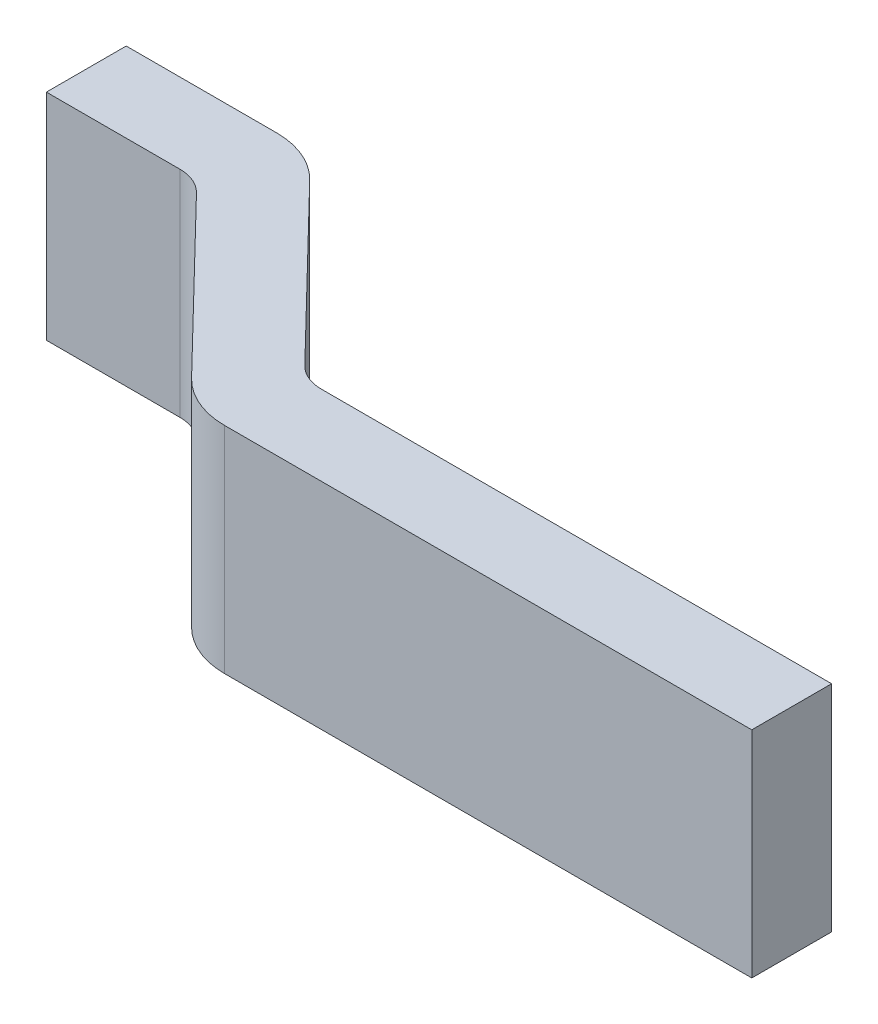
ISO-10303-21;
HEADER;
FILE_DESCRIPTION(('STEP AP214'),'2;1');
FILE_NAME('part.step','',(''),(''),'','','');
FILE_SCHEMA(('AUTOMOTIVE_DESIGN { 1 0 10303 214 1 1 1 1 }'));
ENDSEC;
DATA;
#1=APPLICATION_CONTEXT('core data for automotive mechanical design processes');
#2=APPLICATION_PROTOCOL_DEFINITION('international standard','automotive_design',2000,#1);
#3=PRODUCT_CONTEXT('',#1,'mechanical');
#4=PRODUCT('Part','Part','',(#3));
#5=PRODUCT_RELATED_PRODUCT_CATEGORY('part','',(#4));
#6=PRODUCT_DEFINITION_FORMATION('','',#4);
#7=PRODUCT_DEFINITION_CONTEXT('part definition',#1,'design');
#8=PRODUCT_DEFINITION('design','',#6,#7);
#9=PRODUCT_DEFINITION_SHAPE('','',#8);
#10=(LENGTH_UNIT() NAMED_UNIT(*) SI_UNIT(.MILLI.,.METRE.));
#11=(NAMED_UNIT(*) PLANE_ANGLE_UNIT() SI_UNIT($,.RADIAN.));
#12=(NAMED_UNIT(*) SI_UNIT($,.STERADIAN.) SOLID_ANGLE_UNIT());
#13=UNCERTAINTY_MEASURE_WITH_UNIT(LENGTH_MEASURE(1.E-05),#10,'distance_accuracy_value','');
#14=(GEOMETRIC_REPRESENTATION_CONTEXT(3) GLOBAL_UNCERTAINTY_ASSIGNED_CONTEXT((#13)) GLOBAL_UNIT_ASSIGNED_CONTEXT((#10,
#11,#12)) REPRESENTATION_CONTEXT('',''));
#15=CARTESIAN_POINT('',(0.,0.,0.));
#16=DIRECTION('',(0.,0.,1.));
#17=DIRECTION('',(1.,0.,0.));
#18=AXIS2_PLACEMENT_3D('',#15,#16,#17);
#19=CARTESIAN_POINT('',(-3.065047127576,-2.3,0.39));
#20=DIRECTION('',(0.,-1.,0.));
#21=DIRECTION('',(0.389734378406383,0.,-0.92092731216323));
#22=AXIS2_PLACEMENT_3D('',#19,#20,#21);
#23=CYLINDRICAL_SURFACE('',#22,0.13);
#24=CARTESIAN_POINT('',(-3.065047127576,-2.65,0.39));
#25=DIRECTION('',(0.,1.,0.));
#26=DIRECTION('',(0.389734378406383,0.,-0.92092731216323));
#27=AXIS2_PLACEMENT_3D('',#24,#25,#26);
#28=CIRCLE('',#27,0.13);
#29=CARTESIAN_POINT('',(-2.971728698849,-2.65,0.299492150285071));
#30=VERTEX_POINT('',#29);
#31=CARTESIAN_POINT('',(-3.065047127576,-2.65,0.26));
#32=VERTEX_POINT('',#31);
#33=EDGE_CURVE('E11',#30,#32,#28,.T.);
#34=ORIENTED_EDGE('',*,*,#33,.F.);
#35=DIRECTION('',(0.,-1.,0.));
#36=VECTOR('',#35,1.);
#37=CARTESIAN_POINT('',(-2.971728698849,-2.3,0.299492150285071));
#38=LINE('',#37,#36);
#39=CARTESIAN_POINT('',(-2.971728698849,-1.95,0.299492150285071));
#40=VERTEX_POINT('',#39);
#41=EDGE_CURVE('E24',#40,#30,#38,.T.);
#42=ORIENTED_EDGE('',*,*,#41,.F.);
#43=CARTESIAN_POINT('',(-3.065047127576,-1.95,0.39));
#44=DIRECTION('',(0.,-1.,0.));
#45=DIRECTION('',(0.389734378406383,0.,-0.92092731216323));
#46=AXIS2_PLACEMENT_3D('',#43,#44,#45);
#47=CIRCLE('',#46,0.13);
#48=CARTESIAN_POINT('',(-3.065047127576,-1.95,0.26));
#49=VERTEX_POINT('',#48);
#50=EDGE_CURVE('E201',#49,#40,#47,.T.);
#51=ORIENTED_EDGE('',*,*,#50,.F.);
#52=DIRECTION('',(0.,1.,0.));
#53=VECTOR('',#52,1.);
#54=CARTESIAN_POINT('',(-3.065047127576,-2.3,0.26));
#55=LINE('',#54,#53);
#56=EDGE_CURVE('E37',#32,#49,#55,.T.);
#57=ORIENTED_EDGE('',*,*,#56,.F.);
#58=EDGE_LOOP('',(#34,#42,#51,#57));
#59=FACE_BOUND('',#58,.T.);
#60=ADVANCED_FACE('F17',(#59),#23,.F.);
#61=CARTESIAN_POINT('',(-3.010031418384,-2.3,0.26));
#62=DIRECTION('',(0.,0.,-1.));
#63=DIRECTION('',(-1.,0.,0.));
#64=AXIS2_PLACEMENT_3D('',#61,#62,#63);
#65=PLANE('',#64);
#66=ORIENTED_EDGE('',*,*,#56,.T.);
#67=DIRECTION('',(-1.,0.,0.));
#68=VECTOR('',#67,1.);
#69=CARTESIAN_POINT('',(-2.9,-1.95,0.26));
#70=LINE('',#69,#68);
#71=CARTESIAN_POINT('',(-3.5,-1.95,0.26));
#72=VERTEX_POINT('',#71);
#73=EDGE_CURVE('E198',#49,#72,#70,.T.);
#74=ORIENTED_EDGE('',*,*,#73,.T.);
#75=DIRECTION('',(0.,1.,0.));
#76=VECTOR('',#75,1.);
#77=CARTESIAN_POINT('',(-3.5,-2.3,0.26));
#78=LINE('',#77,#76);
#79=CARTESIAN_POINT('',(-3.5,-2.65,0.26));
#80=VERTEX_POINT('',#79);
#81=EDGE_CURVE('E195',#80,#72,#78,.T.);
#82=ORIENTED_EDGE('',*,*,#81,.F.);
#83=DIRECTION('',(1.,0.,0.));
#84=VECTOR('',#83,1.);
#85=CARTESIAN_POINT('',(-2.9,-2.65,0.26));
#86=LINE('',#85,#84);
#87=EDGE_CURVE('E192',#80,#32,#86,.T.);
#88=ORIENTED_EDGE('',*,*,#87,.T.);
#89=EDGE_LOOP('',(#66,#74,#82,#88));
#90=FACE_BOUND('',#89,.T.);
#91=ADVANCED_FACE('F234',(#90),#65,.F.);
#92=CARTESIAN_POINT('',(-2.21456109233,-2.3,0.52));
#93=DIRECTION('',(0.,-1.,0.));
#94=DIRECTION('',(-0.389734378406383,0.,0.920927312163229));
#95=AXIS2_PLACEMENT_3D('',#92,#93,#94);
#96=CYLINDRICAL_SURFACE('',#95,0.13);
#97=CARTESIAN_POINT('',(-2.21456109233,-2.65,0.52));
#98=DIRECTION('',(0.,1.,0.));
#99=DIRECTION('',(-0.389734378406383,0.,0.920927312163229));
#100=AXIS2_PLACEMENT_3D('',#97,#98,#99);
#101=CIRCLE('',#100,0.13);
#102=CARTESIAN_POINT('',(-2.307879521056,-2.65,0.610507849714929));
#103=VERTEX_POINT('',#102);
#104=CARTESIAN_POINT('',(-2.21456109233,-2.65,0.65));
#105=VERTEX_POINT('',#104);
#106=EDGE_CURVE('E189',#103,#105,#101,.T.);
#107=ORIENTED_EDGE('',*,*,#106,.F.);
#108=DIRECTION('',(0.,-1.,0.));
#109=VECTOR('',#108,1.);
#110=CARTESIAN_POINT('',(-2.307879521056,-2.3,0.610507849714929));
#111=LINE('',#110,#109);
#112=CARTESIAN_POINT('',(-2.307879521056,-1.95,0.610507849714929));
#113=VERTEX_POINT('',#112);
#114=EDGE_CURVE('E187',#113,#103,#111,.T.);
#115=ORIENTED_EDGE('',*,*,#114,.F.);
#116=CARTESIAN_POINT('',(-2.21456109233,-1.95,0.52));
#117=DIRECTION('',(0.,-1.,0.));
#118=DIRECTION('',(-0.389734378406383,0.,0.920927312163229));
#119=AXIS2_PLACEMENT_3D('',#116,#117,#118);
#120=CIRCLE('',#119,0.13);
#121=CARTESIAN_POINT('',(-2.21456109233,-1.95,0.65));
#122=VERTEX_POINT('',#121);
#123=EDGE_CURVE('E185',#122,#113,#120,.T.);
#124=ORIENTED_EDGE('',*,*,#123,.F.);
#125=DIRECTION('',(0.,1.,0.));
#126=VECTOR('',#125,1.);
#127=CARTESIAN_POINT('',(-2.21456109233,-2.3,0.65));
#128=LINE('',#127,#126);
#129=EDGE_CURVE('E183',#105,#122,#128,.T.);
#130=ORIENTED_EDGE('',*,*,#129,.F.);
#131=EDGE_LOOP('',(#107,#115,#124,#130));
#132=FACE_BOUND('',#131,.T.);
#133=ADVANCED_FACE('F219',(#132),#96,.F.);
#134=CARTESIAN_POINT('',(-2.269576801522,-2.3,0.65));
#135=DIRECTION('',(0.,0.,1.));
#136=DIRECTION('',(1.,0.,0.));
#137=AXIS2_PLACEMENT_3D('',#134,#135,#136);
#138=PLANE('',#137);
#139=ORIENTED_EDGE('',*,*,#129,.T.);
#140=DIRECTION('',(1.,0.,0.));
#141=VECTOR('',#140,1.);
#142=CARTESIAN_POINT('',(-2.631777499297,-1.95,0.65));
#143=LINE('',#142,#141);
#144=CARTESIAN_POINT('',(-0.552686390507766,-1.95,0.65));
#145=VERTEX_POINT('',#144);
#146=EDGE_CURVE('E181',#122,#145,#143,.T.);
#147=ORIENTED_EDGE('',*,*,#146,.T.);
#148=DIRECTION('',(0.,-1.,0.));
#149=VECTOR('',#148,1.);
#150=CARTESIAN_POINT('',(-0.552686390507766,-2.3,0.65));
#151=LINE('',#150,#149);
#152=CARTESIAN_POINT('',(-0.552686390507766,-2.65,0.65));
#153=VERTEX_POINT('',#152);
#154=EDGE_CURVE('E129',#145,#153,#151,.T.);
#155=ORIENTED_EDGE('',*,*,#154,.T.);
#156=DIRECTION('',(-1.,0.,0.));
#157=VECTOR('',#156,1.);
#158=CARTESIAN_POINT('',(-2.631777499297,-2.65,0.65));
#159=LINE('',#158,#157);
#160=EDGE_CURVE('E177',#153,#105,#159,.T.);
#161=ORIENTED_EDGE('',*,*,#160,.T.);
#162=EDGE_LOOP('',(#139,#147,#155,#161));
#163=FACE_BOUND('',#162,.T.);
#164=ADVANCED_FACE('F214',(#163),#138,.F.);
#165=CARTESIAN_POINT('',(-2.269576801522,-2.3,0.65));
#166=DIRECTION('',(0.,-1.,0.));
#167=DIRECTION('',(-0.389734378406384,0.,0.920927312163229));
#168=AXIS2_PLACEMENT_3D('',#165,#166,#167);
#169=CYLINDRICAL_SURFACE('',#168,0.26);
#170=CARTESIAN_POINT('',(-2.269576801522,-1.95,0.65));
#171=DIRECTION('',(0.,1.,0.));
#172=DIRECTION('',(-0.389734378406384,0.,0.920927312163229));
#173=AXIS2_PLACEMENT_3D('',#170,#171,#172);
#174=CIRCLE('',#173,0.26);
#175=CARTESIAN_POINT('',(-2.456213658975,-1.95,0.831015699429859));
#176=VERTEX_POINT('',#175);
#177=CARTESIAN_POINT('',(-2.269576801522,-1.95,0.91));
#178=VERTEX_POINT('',#177);
#179=EDGE_CURVE('E124',#176,#178,#174,.T.);
#180=ORIENTED_EDGE('',*,*,#179,.F.);
#181=DIRECTION('',(0.,1.,0.));
#182=VECTOR('',#181,1.);
#183=CARTESIAN_POINT('',(-2.456213658975,-2.3,0.831015699429859));
#184=LINE('',#183,#182);
#185=CARTESIAN_POINT('',(-2.456213658975,-2.65,0.831015699429859));
#186=VERTEX_POINT('',#185);
#187=EDGE_CURVE('E173',#186,#176,#184,.T.);
#188=ORIENTED_EDGE('',*,*,#187,.F.);
#189=CARTESIAN_POINT('',(-2.269576801522,-2.65,0.65));
#190=DIRECTION('',(0.,-1.,0.));
#191=DIRECTION('',(-0.389734378406384,0.,0.920927312163229));
#192=AXIS2_PLACEMENT_3D('',#189,#190,#191);
#193=CIRCLE('',#192,0.26);
#194=CARTESIAN_POINT('',(-2.269576801522,-2.65,0.91));
#195=VERTEX_POINT('',#194);
#196=EDGE_CURVE('E170',#195,#186,#193,.T.);
#197=ORIENTED_EDGE('',*,*,#196,.F.);
#198=DIRECTION('',(0.,-1.,0.));
#199=VECTOR('',#198,1.);
#200=CARTESIAN_POINT('',(-2.269576801522,-2.3,0.91));
#201=LINE('',#200,#199);
#202=EDGE_CURVE('E168',#178,#195,#201,.T.);
#203=ORIENTED_EDGE('',*,*,#202,.F.);
#204=EDGE_LOOP('',(#180,#188,#197,#203));
#205=FACE_BOUND('',#204,.T.);
#206=ADVANCED_FACE('F207',(#205),#169,.T.);
#207=CARTESIAN_POINT('',(-2.379608219906,-2.3,0.91));
#208=DIRECTION('',(0.717834067126796,0.,-0.696214228576379));
#209=DIRECTION('',(-0.696214228576379,0.,-0.717834067126796));
#210=AXIS2_PLACEMENT_3D('',#207,#208,#209);
#211=PLANE('',#210);
#212=ORIENTED_EDGE('',*,*,#41,.T.);
#213=DIRECTION('',(0.696214228576379,0.,0.717834067126796));
#214=VECTOR('',#213,1.);
#215=CARTESIAN_POINT('',(-2.379608219906,-2.65,0.91));
#216=LINE('',#215,#214);
#217=EDGE_CURVE('E166',#30,#186,#216,.T.);
#218=ORIENTED_EDGE('',*,*,#217,.T.);
#219=ORIENTED_EDGE('',*,*,#187,.T.);
#220=DIRECTION('',(-0.696214228576379,0.,-0.717834067126796));
#221=VECTOR('',#220,1.);
#222=CARTESIAN_POINT('',(-2.379608219906,-1.95,0.91));
#223=LINE('',#222,#221);
#224=EDGE_CURVE('E164',#176,#40,#223,.T.);
#225=ORIENTED_EDGE('',*,*,#224,.T.);
#226=EDGE_LOOP('',(#212,#218,#219,#225));
#227=FACE_BOUND('',#226,.T.);
#228=ADVANCED_FACE('F205',(#227),#211,.F.);
#229=CARTESIAN_POINT('',(-2.026343195254,-2.65,0.455));
#230=DIRECTION('',(0.,1.,0.));
#231=DIRECTION('',(0.,0.,-1.));
#232=AXIS2_PLACEMENT_3D('',#229,#230,#231);
#233=PLANE('',#232);
#234=ORIENTED_EDGE('',*,*,#196,.T.);
#235=ORIENTED_EDGE('',*,*,#217,.F.);
#236=ORIENTED_EDGE('',*,*,#33,.T.);
#237=ORIENTED_EDGE('',*,*,#87,.F.);
#238=DIRECTION('',(0.,0.,1.));
#239=VECTOR('',#238,1.);
#240=CARTESIAN_POINT('',(-3.5,-2.65,0.26));
#241=LINE('',#240,#239);
#242=CARTESIAN_POINT('',(-3.5,-2.65,0.));
#243=VERTEX_POINT('',#242);
#244=EDGE_CURVE('E161',#243,#80,#241,.T.);
#245=ORIENTED_EDGE('',*,*,#244,.F.);
#246=DIRECTION('',(-1.,0.,0.));
#247=VECTOR('',#246,1.);
#248=CARTESIAN_POINT('',(-3.5,-2.65,0.));
#249=LINE('',#248,#247);
#250=CARTESIAN_POINT('',(-3.010031418384,-2.65,0.));
#251=VERTEX_POINT('',#250);
#252=EDGE_CURVE('E158',#251,#243,#249,.T.);
#253=ORIENTED_EDGE('',*,*,#252,.F.);
#254=CARTESIAN_POINT('',(-3.010031418384,-2.65,0.26));
#255=DIRECTION('',(0.,-1.,0.));
#256=DIRECTION('',(0.389734378406383,0.,-0.920927312163229));
#257=AXIS2_PLACEMENT_3D('',#254,#255,#256);
#258=CIRCLE('',#257,0.26);
#259=CARTESIAN_POINT('',(-2.823394560931,-2.65,0.0789843005701413));
#260=VERTEX_POINT('',#259);
#261=EDGE_CURVE('E156',#251,#260,#258,.T.);
#262=ORIENTED_EDGE('',*,*,#261,.T.);
#263=DIRECTION('',(-0.696214228576379,0.,-0.717834067126796));
#264=VECTOR('',#263,1.);
#265=CARTESIAN_POINT('',(-2.9,-2.65,0.));
#266=LINE('',#265,#264);
#267=EDGE_CURVE('E153',#103,#260,#266,.T.);
#268=ORIENTED_EDGE('',*,*,#267,.F.);
#269=ORIENTED_EDGE('',*,*,#106,.T.);
#270=ORIENTED_EDGE('',*,*,#160,.F.);
#271=DIRECTION('',(0.,0.,-1.));
#272=VECTOR('',#271,1.);
#273=CARTESIAN_POINT('',(-0.552686390507766,-2.65,0.65));
#274=LINE('',#273,#272);
#275=CARTESIAN_POINT('',(-0.552686390507766,-2.65,0.91));
#276=VERTEX_POINT('',#275);
#277=EDGE_CURVE('E151',#276,#153,#274,.T.);
#278=ORIENTED_EDGE('',*,*,#277,.F.);
#279=DIRECTION('',(1.,0.,0.));
#280=VECTOR('',#279,1.);
#281=CARTESIAN_POINT('',(-0.552686390507766,-2.65,0.91));
#282=LINE('',#281,#280);
#283=EDGE_CURVE('E112',#195,#276,#282,.T.);
#284=ORIENTED_EDGE('',*,*,#283,.F.);
#285=EDGE_LOOP('',(#234,#235,#236,#237,#245,#253,#262,#268,#269,#270,#278,#284));
#286=FACE_BOUND('',#285,.T.);
#287=ADVANCED_FACE('F209',(#286),#233,.F.);
#288=CARTESIAN_POINT('',(-3.010031418384,-2.3,0.26));
#289=DIRECTION('',(0.,-1.,0.));
#290=DIRECTION('',(0.389734378406383,0.,-0.920927312163229));
#291=AXIS2_PLACEMENT_3D('',#288,#289,#290);
#292=CYLINDRICAL_SURFACE('',#291,0.26);
#293=CARTESIAN_POINT('',(-3.010031418384,-1.95,0.26));
#294=DIRECTION('',(0.,1.,0.));
#295=DIRECTION('',(0.389734378406383,0.,-0.920927312163229));
#296=AXIS2_PLACEMENT_3D('',#293,#294,#295);
#297=CIRCLE('',#296,0.26);
#298=CARTESIAN_POINT('',(-2.823394560931,-1.95,0.0789843005701413));
#299=VERTEX_POINT('',#298);
#300=CARTESIAN_POINT('',(-3.010031418384,-1.95,0.));
#301=VERTEX_POINT('',#300);
#302=EDGE_CURVE('E148',#299,#301,#297,.T.);
#303=ORIENTED_EDGE('',*,*,#302,.F.);
#304=DIRECTION('',(0.,1.,0.));
#305=VECTOR('',#304,1.);
#306=CARTESIAN_POINT('',(-2.823394560931,-2.3,0.0789843005701413));
#307=LINE('',#306,#305);
#308=EDGE_CURVE('E145',#260,#299,#307,.T.);
#309=ORIENTED_EDGE('',*,*,#308,.F.);
#310=ORIENTED_EDGE('',*,*,#261,.F.);
#311=DIRECTION('',(0.,-1.,0.));
#312=VECTOR('',#311,1.);
#313=CARTESIAN_POINT('',(-3.010031418384,-2.3,0.));
#314=LINE('',#313,#312);
#315=EDGE_CURVE('E142',#301,#251,#314,.T.);
#316=ORIENTED_EDGE('',*,*,#315,.F.);
#317=EDGE_LOOP('',(#303,#309,#310,#316));
#318=FACE_BOUND('',#317,.T.);
#319=ADVANCED_FACE('F225',(#318),#292,.T.);
#320=CARTESIAN_POINT('',(-2.9,-2.3,0.));
#321=DIRECTION('',(-0.717834067126796,0.,0.696214228576379));
#322=DIRECTION('',(0.696214228576379,0.,0.717834067126796));
#323=AXIS2_PLACEMENT_3D('',#320,#321,#322);
#324=PLANE('',#323);
#325=ORIENTED_EDGE('',*,*,#114,.T.);
#326=ORIENTED_EDGE('',*,*,#267,.T.);
#327=ORIENTED_EDGE('',*,*,#308,.T.);
#328=DIRECTION('',(0.696214228576379,0.,0.717834067126796));
#329=VECTOR('',#328,1.);
#330=CARTESIAN_POINT('',(-2.9,-1.95,0.));
#331=LINE('',#330,#329);
#332=EDGE_CURVE('E139',#299,#113,#331,.T.);
#333=ORIENTED_EDGE('',*,*,#332,.T.);
#334=EDGE_LOOP('',(#325,#326,#327,#333));
#335=FACE_BOUND('',#334,.T.);
#336=ADVANCED_FACE('F221',(#335),#324,.F.);
#337=CARTESIAN_POINT('',(-3.5,-2.3,0.));
#338=DIRECTION('',(0.,0.,1.));
#339=DIRECTION('',(1.,0.,0.));
#340=AXIS2_PLACEMENT_3D('',#337,#338,#339);
#341=PLANE('',#340);
#342=ORIENTED_EDGE('',*,*,#315,.T.);
#343=ORIENTED_EDGE('',*,*,#252,.T.);
#344=DIRECTION('',(0.,1.,0.));
#345=VECTOR('',#344,1.);
#346=CARTESIAN_POINT('',(-3.5,-2.3,0.));
#347=LINE('',#346,#345);
#348=CARTESIAN_POINT('',(-3.5,-1.95,0.));
#349=VERTEX_POINT('',#348);
#350=EDGE_CURVE('E137',#243,#349,#347,.T.);
#351=ORIENTED_EDGE('',*,*,#350,.T.);
#352=DIRECTION('',(1.,0.,0.));
#353=VECTOR('',#352,1.);
#354=CARTESIAN_POINT('',(-3.5,-1.95,0.));
#355=LINE('',#354,#353);
#356=EDGE_CURVE('E134',#349,#301,#355,.T.);
#357=ORIENTED_EDGE('',*,*,#356,.T.);
#358=EDGE_LOOP('',(#342,#343,#351,#357));
#359=FACE_BOUND('',#358,.T.);
#360=ADVANCED_FACE('F235',(#359),#341,.F.);
#361=CARTESIAN_POINT('',(-3.5,-2.3,0.26));
#362=DIRECTION('',(1.,0.,0.));
#363=DIRECTION('',(0.,0.,-1.));
#364=AXIS2_PLACEMENT_3D('',#361,#362,#363);
#365=PLANE('',#364);
#366=ORIENTED_EDGE('',*,*,#350,.F.);
#367=ORIENTED_EDGE('',*,*,#244,.T.);
#368=ORIENTED_EDGE('',*,*,#81,.T.);
#369=DIRECTION('',(0.,0.,-1.));
#370=VECTOR('',#369,1.);
#371=CARTESIAN_POINT('',(-3.5,-1.95,0.26));
#372=LINE('',#371,#370);
#373=EDGE_CURVE('E116',#72,#349,#372,.T.);
#374=ORIENTED_EDGE('',*,*,#373,.T.);
#375=EDGE_LOOP('',(#366,#367,#368,#374));
#376=FACE_BOUND('',#375,.T.);
#377=ADVANCED_FACE('F231',(#376),#365,.F.);
#378=CARTESIAN_POINT('',(-0.552686390507766,-2.3,0.91));
#379=DIRECTION('',(0.,0.,-1.));
#380=DIRECTION('',(-1.,0.,0.));
#381=AXIS2_PLACEMENT_3D('',#378,#379,#380);
#382=PLANE('',#381);
#383=ORIENTED_EDGE('',*,*,#202,.T.);
#384=ORIENTED_EDGE('',*,*,#283,.T.);
#385=DIRECTION('',(0.,1.,0.));
#386=VECTOR('',#385,1.);
#387=CARTESIAN_POINT('',(-0.552686390507766,-2.3,0.91));
#388=LINE('',#387,#386);
#389=CARTESIAN_POINT('',(-0.552686390507766,-1.95,0.91));
#390=VERTEX_POINT('',#389);
#391=EDGE_CURVE('E106',#276,#390,#388,.T.);
#392=ORIENTED_EDGE('',*,*,#391,.T.);
#393=DIRECTION('',(-1.,0.,0.));
#394=VECTOR('',#393,1.);
#395=CARTESIAN_POINT('',(-0.552686390507766,-1.95,0.91));
#396=LINE('',#395,#394);
#397=EDGE_CURVE('E110',#390,#178,#396,.T.);
#398=ORIENTED_EDGE('',*,*,#397,.T.);
#399=EDGE_LOOP('',(#383,#384,#392,#398));
#400=FACE_BOUND('',#399,.T.);
#401=ADVANCED_FACE('F109',(#400),#382,.F.);
#402=CARTESIAN_POINT('',(-0.552686390507766,-2.3,0.65));
#403=DIRECTION('',(-1.,0.,0.));
#404=DIRECTION('',(0.,0.,1.));
#405=AXIS2_PLACEMENT_3D('',#402,#403,#404);
#406=PLANE('',#405);
#407=ORIENTED_EDGE('',*,*,#391,.F.);
#408=ORIENTED_EDGE('',*,*,#277,.T.);
#409=ORIENTED_EDGE('',*,*,#154,.F.);
#410=DIRECTION('',(0.,0.,1.));
#411=VECTOR('',#410,1.);
#412=CARTESIAN_POINT('',(-0.552686390507766,-1.95,0.65));
#413=LINE('',#412,#411);
#414=EDGE_CURVE('E122',#145,#390,#413,.T.);
#415=ORIENTED_EDGE('',*,*,#414,.T.);
#416=EDGE_LOOP('',(#407,#408,#409,#415));
#417=FACE_BOUND('',#416,.T.);
#418=ADVANCED_FACE('F128',(#417),#406,.F.);
#419=CARTESIAN_POINT('',(-2.026343195254,-1.95,0.455));
#420=DIRECTION('',(0.,-1.,0.));
#421=DIRECTION('',(0.,0.,1.));
#422=AXIS2_PLACEMENT_3D('',#419,#420,#421);
#423=PLANE('',#422);
#424=ORIENTED_EDGE('',*,*,#179,.T.);
#425=ORIENTED_EDGE('',*,*,#397,.F.);
#426=ORIENTED_EDGE('',*,*,#414,.F.);
#427=ORIENTED_EDGE('',*,*,#146,.F.);
#428=ORIENTED_EDGE('',*,*,#123,.T.);
#429=ORIENTED_EDGE('',*,*,#332,.F.);
#430=ORIENTED_EDGE('',*,*,#302,.T.);
#431=ORIENTED_EDGE('',*,*,#356,.F.);
#432=ORIENTED_EDGE('',*,*,#373,.F.);
#433=ORIENTED_EDGE('',*,*,#73,.F.);
#434=ORIENTED_EDGE('',*,*,#50,.T.);
#435=ORIENTED_EDGE('',*,*,#224,.F.);
#436=EDGE_LOOP('',(#424,#425,#426,#427,#428,#429,#430,#431,#432,#433,#434,#435));
#437=FACE_BOUND('',#436,.T.);
#438=ADVANCED_FACE('F120',(#437),#423,.F.);
#439=CLOSED_SHELL('',(#60,#91,#133,#164,#206,#228,#287,#319,#336,#360,#377,#401,#418,#438));
#440=MANIFOLD_SOLID_BREP('B1',#439);
#441=ADVANCED_BREP_SHAPE_REPRESENTATION('',(#18,#440),#14);
#442=SHAPE_DEFINITION_REPRESENTATION(#9,#441);
ENDSEC;
END-ISO-10303-21;
